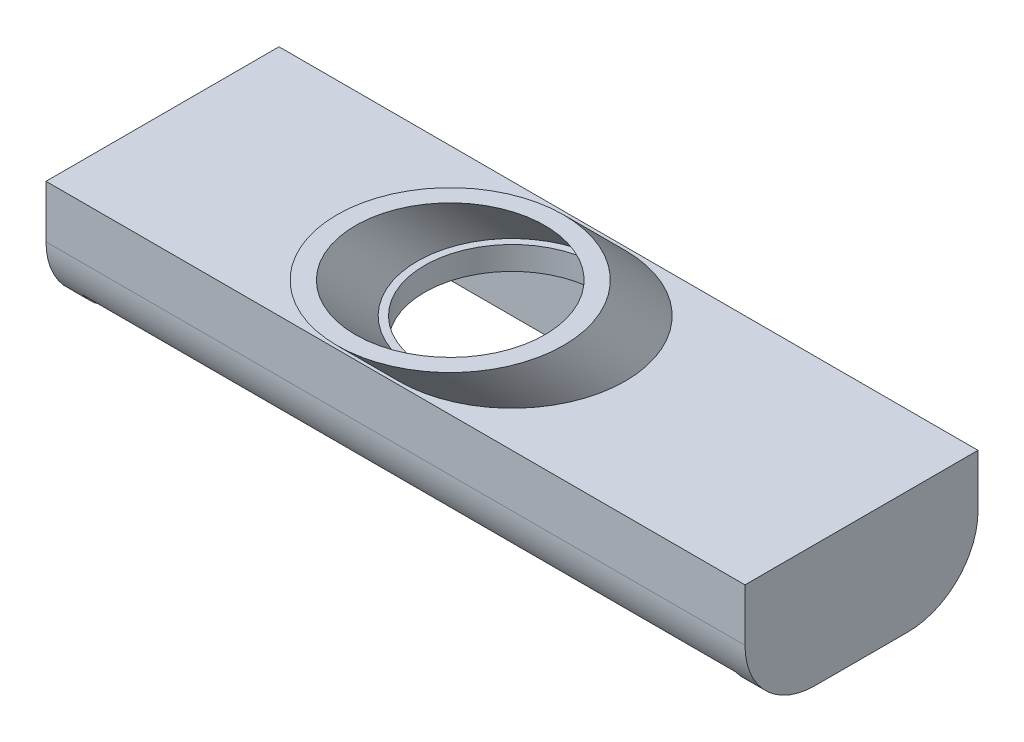
ISO-10303-21;
HEADER;
FILE_DESCRIPTION(('STEP AP214'),'2;1');
FILE_NAME('part.step','',(''),(''),'','','');
FILE_SCHEMA(('AUTOMOTIVE_DESIGN { 1 0 10303 214 1 1 1 1 }'));
ENDSEC;
DATA;
#1=APPLICATION_CONTEXT('core data for automotive mechanical design processes');
#2=APPLICATION_PROTOCOL_DEFINITION('international standard','automotive_design',2000,#1);
#3=PRODUCT_CONTEXT('',#1,'mechanical');
#4=PRODUCT('Part','Part','',(#3));
#5=PRODUCT_RELATED_PRODUCT_CATEGORY('part','',(#4));
#6=PRODUCT_DEFINITION_FORMATION('','',#4);
#7=PRODUCT_DEFINITION_CONTEXT('part definition',#1,'design');
#8=PRODUCT_DEFINITION('design','',#6,#7);
#9=PRODUCT_DEFINITION_SHAPE('','',#8);
#10=(LENGTH_UNIT() NAMED_UNIT(*) SI_UNIT(.MILLI.,.METRE.));
#11=(NAMED_UNIT(*) PLANE_ANGLE_UNIT() SI_UNIT($,.RADIAN.));
#12=(NAMED_UNIT(*) SI_UNIT($,.STERADIAN.) SOLID_ANGLE_UNIT());
#13=UNCERTAINTY_MEASURE_WITH_UNIT(LENGTH_MEASURE(1.E-05),#10,'distance_accuracy_value','');
#14=(GEOMETRIC_REPRESENTATION_CONTEXT(3) GLOBAL_UNCERTAINTY_ASSIGNED_CONTEXT((#13)) GLOBAL_UNIT_ASSIGNED_CONTEXT((#10,
#11,#12)) REPRESENTATION_CONTEXT('',''));
#15=CARTESIAN_POINT('',(0.,0.,0.));
#16=DIRECTION('',(0.,0.,1.));
#17=DIRECTION('',(1.,0.,0.));
#18=AXIS2_PLACEMENT_3D('',#15,#16,#17);
#19=CARTESIAN_POINT('',(0.,-12.,0.));
#20=DIRECTION('',(0.,-1.,0.));
#21=DIRECTION('',(0.,0.,-1.));
#22=AXIS2_PLACEMENT_3D('',#19,#20,#21);
#23=PLANE('',#22);
#24=DIRECTION('',(0.,0.,-1.));
#25=VECTOR('',#24,1.);
#26=CARTESIAN_POINT('',(8.76107220651789,-12.,38.936170212766));
#27=LINE('',#26,#25);
#28=CARTESIAN_POINT('',(8.76107220651789,-12.,36.6829645575749));
#29=VERTEX_POINT('',#28);
#30=CARTESIAN_POINT('',(8.76107220651789,-12.,1.18937586795699));
#31=VERTEX_POINT('',#30);
#32=EDGE_CURVE('E245',#29,#31,#27,.T.);
#33=ORIENTED_EDGE('',*,*,#32,.F.);
#34=DIRECTION('',(-1.,0.,0.));
#35=VECTOR('',#34,1.);
#36=CARTESIAN_POINT('',(8.76107220651789,-12.,36.6829645575749));
#37=LINE('',#36,#35);
#38=CARTESIAN_POINT('',(-103.322695035461,-12.,36.6829645575749));
#39=VERTEX_POINT('',#38);
#40=EDGE_CURVE('E215',#29,#39,#37,.T.);
#41=ORIENTED_EDGE('',*,*,#40,.T.);
#42=DIRECTION('',(0.,0.,1.));
#43=VECTOR('',#42,1.);
#44=CARTESIAN_POINT('',(-103.322695035461,-12.,38.936170212766));
#45=LINE('',#44,#43);
#46=CARTESIAN_POINT('',(-103.322695035461,-12.,34.936170212766));
#47=VERTEX_POINT('',#46);
#48=EDGE_CURVE('E191',#47,#39,#45,.T.);
#49=ORIENTED_EDGE('',*,*,#48,.F.);
#50=DIRECTION('',(1.,0.,0.));
#51=VECTOR('',#50,1.);
#52=CARTESIAN_POINT('',(0.,-12.,34.9361702127659));
#53=LINE('',#52,#51);
#54=CARTESIAN_POINT('',(8.67730496453901,-12.,34.9361702127659));
#55=VERTEX_POINT('',#54);
#56=EDGE_CURVE('E150',#47,#55,#53,.T.);
#57=ORIENTED_EDGE('',*,*,#56,.T.);
#58=DIRECTION('',(0.,0.,-1.));
#59=VECTOR('',#58,1.);
#60=CARTESIAN_POINT('',(8.67730496453902,-12.,0.));
#61=LINE('',#60,#59);
#62=CARTESIAN_POINT('',(8.67730496453902,-12.,2.93617021276596));
#63=VERTEX_POINT('',#62);
#64=EDGE_CURVE('E151',#55,#63,#61,.T.);
#65=ORIENTED_EDGE('',*,*,#64,.T.);
#66=DIRECTION('',(-1.,0.,0.));
#67=VECTOR('',#66,1.);
#68=CARTESIAN_POINT('',(0.,-12.,2.93617021276596));
#69=LINE('',#68,#67);
#70=CARTESIAN_POINT('',(-103.322695035461,-12.,2.93617021276594));
#71=VERTEX_POINT('',#70);
#72=EDGE_CURVE('E139',#63,#71,#69,.T.);
#73=ORIENTED_EDGE('',*,*,#72,.T.);
#74=CARTESIAN_POINT('',(-103.322695035461,-12.,1.189375867957));
#75=VERTEX_POINT('',#74);
#76=EDGE_CURVE('E206',#75,#71,#45,.T.);
#77=ORIENTED_EDGE('',*,*,#76,.F.);
#78=DIRECTION('',(1.,0.,0.));
#79=VECTOR('',#78,1.);
#80=CARTESIAN_POINT('',(-103.322695035461,-12.,1.189375867957));
#81=LINE('',#80,#79);
#82=EDGE_CURVE('E213',#75,#31,#81,.T.);
#83=ORIENTED_EDGE('',*,*,#82,.T.);
#84=EDGE_LOOP('',(#33,#41,#49,#57,#65,#73,#77,#83));
#85=FACE_BOUND('',#84,.T.);
#86=ADVANCED_FACE('F35',(#85),#23,.T.);
#87=CARTESIAN_POINT('',(0.,4.,0.));
#88=DIRECTION('',(0.,1.,0.));
#89=DIRECTION('',(0.,0.,1.));
#90=AXIS2_PLACEMENT_3D('',#87,#88,#89);
#91=PLANE('',#90);
#92=DIRECTION('',(0.,0.,1.));
#93=VECTOR('',#92,1.);
#94=CARTESIAN_POINT('',(-107.322695035461,4.,-1.06382978723404));
#95=LINE('',#94,#93);
#96=CARTESIAN_POINT('',(-107.322695035461,4.,-1.06382978723404));
#97=VERTEX_POINT('',#96);
#98=CARTESIAN_POINT('',(-107.322695035461,4.,38.936170212766));
#99=VERTEX_POINT('',#98);
#100=EDGE_CURVE('E163',#97,#99,#95,.T.);
#101=ORIENTED_EDGE('',*,*,#100,.T.);
#102=DIRECTION('',(1.,0.,0.));
#103=VECTOR('',#102,1.);
#104=CARTESIAN_POINT('',(-107.322695035461,4.,38.936170212766));
#105=LINE('',#104,#103);
#106=CARTESIAN_POINT('',(12.677304964539,4.,38.936170212766));
#107=VERTEX_POINT('',#106);
#108=EDGE_CURVE('E166',#99,#107,#105,.T.);
#109=ORIENTED_EDGE('',*,*,#108,.T.);
#110=DIRECTION('',(0.,0.,-1.));
#111=VECTOR('',#110,1.);
#112=CARTESIAN_POINT('',(12.677304964539,4.,-1.06382978723404));
#113=LINE('',#112,#111);
#114=CARTESIAN_POINT('',(12.677304964539,4.,-1.06382978723404));
#115=VERTEX_POINT('',#114);
#116=EDGE_CURVE('E175',#107,#115,#113,.T.);
#117=ORIENTED_EDGE('',*,*,#116,.T.);
#118=DIRECTION('',(-1.,0.,0.));
#119=VECTOR('',#118,1.);
#120=CARTESIAN_POINT('',(-107.322695035461,4.,-1.06382978723404));
#121=LINE('',#120,#119);
#122=EDGE_CURVE('E177',#115,#97,#121,.T.);
#123=ORIENTED_EDGE('',*,*,#122,.T.);
#124=EDGE_LOOP('',(#101,#109,#117,#123));
#125=FACE_BOUND('',#124,.T.);
#126=CARTESIAN_POINT('',(-47.322695035461,4.,18.936170212766));
#127=DIRECTION('',(0.,1.,0.));
#128=DIRECTION('',(0.,0.,1.));
#129=AXIS2_PLACEMENT_3D('',#126,#127,#128);
#130=CIRCLE('',#129,19.4409983521772);
#131=CARTESIAN_POINT('',(-47.322695035461,4.,38.3771685649432));
#132=VERTEX_POINT('',#131);
#133=EDGE_CURVE('E276',#132,#132,#130,.T.);
#134=ORIENTED_EDGE('',*,*,#133,.F.);
#135=EDGE_LOOP('',(#134));
#136=FACE_BOUND('',#135,.T.);
#137=ADVANCED_FACE('F295',(#125,#136),#91,.T.);
#138=CARTESIAN_POINT('',(-107.322695035461,4.,-1.06382978723404));
#139=DIRECTION('',(1.,0.,0.));
#140=DIRECTION('',(0.,0.,-1.));
#141=AXIS2_PLACEMENT_3D('',#138,#139,#140);
#142=PLANE('',#141);
#143=DIRECTION('',(0.,0.,-1.));
#144=VECTOR('',#143,1.);
#145=CARTESIAN_POINT('',(-107.322695035461,-17.,38.936170212766));
#146=LINE('',#145,#144);
#147=CARTESIAN_POINT('',(-107.322695035461,-17.,26.936170212766));
#148=VERTEX_POINT('',#147);
#149=CARTESIAN_POINT('',(-107.322695035461,-17.,10.936170212766));
#150=VERTEX_POINT('',#149);
#151=EDGE_CURVE('E209',#148,#150,#146,.T.);
#152=ORIENTED_EDGE('',*,*,#151,.F.);
#153=CARTESIAN_POINT('',(-107.322695035461,-5.,26.936170212766));
#154=DIRECTION('',(1.,0.,0.));
#155=DIRECTION('',(0.,0.,-1.));
#156=AXIS2_PLACEMENT_3D('',#153,#154,#155);
#157=CIRCLE('',#156,12.);
#158=CARTESIAN_POINT('',(-107.322695035461,-5.,38.936170212766));
#159=VERTEX_POINT('',#158);
#160=EDGE_CURVE('E227',#148,#159,#157,.F.);
#161=ORIENTED_EDGE('',*,*,#160,.T.);
#162=DIRECTION('',(0.,-1.,0.));
#163=VECTOR('',#162,1.);
#164=CARTESIAN_POINT('',(-107.322695035461,4.,38.936170212766));
#165=LINE('',#164,#163);
#166=EDGE_CURVE('E186',#99,#159,#165,.T.);
#167=ORIENTED_EDGE('',*,*,#166,.F.);
#168=ORIENTED_EDGE('',*,*,#100,.F.);
#169=DIRECTION('',(0.,-1.,0.));
#170=VECTOR('',#169,1.);
#171=CARTESIAN_POINT('',(-107.322695035461,4.,-1.06382978723404));
#172=LINE('',#171,#170);
#173=CARTESIAN_POINT('',(-107.322695035461,-5.,-1.06382978723404));
#174=VERTEX_POINT('',#173);
#175=EDGE_CURVE('E179',#97,#174,#172,.T.);
#176=ORIENTED_EDGE('',*,*,#175,.T.);
#177=CARTESIAN_POINT('',(-107.322695035461,-5.,10.936170212766));
#178=DIRECTION('',(1.,0.,0.));
#179=DIRECTION('',(0.,0.,-1.));
#180=AXIS2_PLACEMENT_3D('',#177,#178,#179);
#181=CIRCLE('',#180,12.);
#182=EDGE_CURVE('E225',#174,#150,#181,.F.);
#183=ORIENTED_EDGE('',*,*,#182,.T.);
#184=EDGE_LOOP('',(#152,#161,#167,#168,#176,#183));
#185=FACE_BOUND('',#184,.T.);
#186=ADVANCED_FACE('F322',(#185),#142,.F.);
#187=CARTESIAN_POINT('',(-107.322695035461,4.,38.936170212766));
#188=DIRECTION('',(0.,0.,-1.));
#189=DIRECTION('',(-1.,0.,0.));
#190=AXIS2_PLACEMENT_3D('',#187,#188,#189);
#191=PLANE('',#190);
#192=ORIENTED_EDGE('',*,*,#166,.T.);
#193=DIRECTION('',(-1.,0.,0.));
#194=VECTOR('',#193,1.);
#195=CARTESIAN_POINT('',(-107.322695035461,-5.,38.936170212766));
#196=LINE('',#195,#194);
#197=CARTESIAN_POINT('',(12.677304964539,-5.,38.936170212766));
#198=VERTEX_POINT('',#197);
#199=EDGE_CURVE('E58',#159,#198,#196,.F.);
#200=ORIENTED_EDGE('',*,*,#199,.T.);
#201=DIRECTION('',(0.,-1.,0.));
#202=VECTOR('',#201,1.);
#203=CARTESIAN_POINT('',(12.677304964539,4.,38.936170212766));
#204=LINE('',#203,#202);
#205=EDGE_CURVE('E184',#107,#198,#204,.T.);
#206=ORIENTED_EDGE('',*,*,#205,.F.);
#207=ORIENTED_EDGE('',*,*,#108,.F.);
#208=EDGE_LOOP('',(#192,#200,#206,#207));
#209=FACE_BOUND('',#208,.T.);
#210=ADVANCED_FACE('F319',(#209),#191,.F.);
#211=CARTESIAN_POINT('',(12.677304964539,4.,-1.06382978723404));
#212=DIRECTION('',(-1.,0.,0.));
#213=DIRECTION('',(0.,0.,1.));
#214=AXIS2_PLACEMENT_3D('',#211,#212,#213);
#215=PLANE('',#214);
#216=ORIENTED_EDGE('',*,*,#205,.T.);
#217=CARTESIAN_POINT('',(12.677304964539,-5.,26.936170212766));
#218=DIRECTION('',(-1.,0.,0.));
#219=DIRECTION('',(0.,0.,1.));
#220=AXIS2_PLACEMENT_3D('',#217,#218,#219);
#221=CIRCLE('',#220,12.);
#222=CARTESIAN_POINT('',(12.677304964539,-17.,26.936170212766));
#223=VERTEX_POINT('',#222);
#224=EDGE_CURVE('E43',#198,#223,#221,.F.);
#225=ORIENTED_EDGE('',*,*,#224,.T.);
#226=DIRECTION('',(0.,0.,1.));
#227=VECTOR('',#226,1.);
#228=CARTESIAN_POINT('',(12.677304964539,-17.,38.936170212766));
#229=LINE('',#228,#227);
#230=CARTESIAN_POINT('',(12.677304964539,-17.,10.936170212766));
#231=VERTEX_POINT('',#230);
#232=EDGE_CURVE('E233',#231,#223,#229,.T.);
#233=ORIENTED_EDGE('',*,*,#232,.F.);
#234=CARTESIAN_POINT('',(12.677304964539,-5.,10.936170212766));
#235=DIRECTION('',(-1.,0.,0.));
#236=DIRECTION('',(0.,0.,1.));
#237=AXIS2_PLACEMENT_3D('',#234,#235,#236);
#238=CIRCLE('',#237,12.);
#239=CARTESIAN_POINT('',(12.677304964539,-5.,-1.06382978723404));
#240=VERTEX_POINT('',#239);
#241=EDGE_CURVE('E50',#231,#240,#238,.F.);
#242=ORIENTED_EDGE('',*,*,#241,.T.);
#243=DIRECTION('',(0.,-1.,0.));
#244=VECTOR('',#243,1.);
#245=CARTESIAN_POINT('',(12.677304964539,4.,-1.06382978723404));
#246=LINE('',#245,#244);
#247=EDGE_CURVE('E182',#115,#240,#246,.T.);
#248=ORIENTED_EDGE('',*,*,#247,.F.);
#249=ORIENTED_EDGE('',*,*,#116,.F.);
#250=EDGE_LOOP('',(#216,#225,#233,#242,#248,#249));
#251=FACE_BOUND('',#250,.T.);
#252=ADVANCED_FACE('F232',(#251),#215,.F.);
#253=CARTESIAN_POINT('',(-107.322695035461,4.,-1.06382978723404));
#254=DIRECTION('',(0.,0.,1.));
#255=DIRECTION('',(1.,0.,0.));
#256=AXIS2_PLACEMENT_3D('',#253,#254,#255);
#257=PLANE('',#256);
#258=ORIENTED_EDGE('',*,*,#247,.T.);
#259=DIRECTION('',(1.,0.,0.));
#260=VECTOR('',#259,1.);
#261=CARTESIAN_POINT('',(-107.322695035461,-5.,-1.06382978723404));
#262=LINE('',#261,#260);
#263=EDGE_CURVE('E11',#240,#174,#262,.F.);
#264=ORIENTED_EDGE('',*,*,#263,.T.);
#265=ORIENTED_EDGE('',*,*,#175,.F.);
#266=ORIENTED_EDGE('',*,*,#122,.F.);
#267=EDGE_LOOP('',(#258,#264,#265,#266));
#268=FACE_BOUND('',#267,.T.);
#269=ADVANCED_FACE('F305',(#268),#257,.F.);
#270=CARTESIAN_POINT('',(8.67730496453902,-12.,0.));
#271=DIRECTION('',(1.,0.,0.));
#272=DIRECTION('',(0.,0.,-1.));
#273=AXIS2_PLACEMENT_3D('',#270,#271,#272);
#274=PLANE('',#273);
#275=DIRECTION('',(0.,0.,-1.));
#276=VECTOR('',#275,1.);
#277=CARTESIAN_POINT('',(8.67730496453902,0.,0.));
#278=LINE('',#277,#276);
#279=CARTESIAN_POINT('',(8.67730496453901,0.,34.9361702127659));
#280=VERTEX_POINT('',#279);
#281=CARTESIAN_POINT('',(8.67730496453902,0.,2.93617021276596));
#282=VERTEX_POINT('',#281);
#283=EDGE_CURVE('E162',#280,#282,#278,.T.);
#284=ORIENTED_EDGE('',*,*,#283,.T.);
#285=DIRECTION('',(0.,1.,0.));
#286=VECTOR('',#285,1.);
#287=CARTESIAN_POINT('',(8.67730496453902,-12.,2.93617021276596));
#288=LINE('',#287,#286);
#289=EDGE_CURVE('E144',#63,#282,#288,.T.);
#290=ORIENTED_EDGE('',*,*,#289,.F.);
#291=ORIENTED_EDGE('',*,*,#64,.F.);
#292=DIRECTION('',(0.,1.,0.));
#293=VECTOR('',#292,1.);
#294=CARTESIAN_POINT('',(8.67730496453901,-12.,34.9361702127659));
#295=LINE('',#294,#293);
#296=EDGE_CURVE('E171',#55,#280,#295,.T.);
#297=ORIENTED_EDGE('',*,*,#296,.T.);
#298=EDGE_LOOP('',(#284,#290,#291,#297));
#299=FACE_BOUND('',#298,.T.);
#300=ADVANCED_FACE('F161',(#299),#274,.F.);
#301=CARTESIAN_POINT('',(0.,-12.,2.93617021276596));
#302=DIRECTION('',(0.,0.,-1.));
#303=DIRECTION('',(-1.,0.,0.));
#304=AXIS2_PLACEMENT_3D('',#301,#302,#303);
#305=PLANE('',#304);
#306=DIRECTION('',(-1.,0.,0.));
#307=VECTOR('',#306,1.);
#308=CARTESIAN_POINT('',(0.,0.,2.93617021276596));
#309=LINE('',#308,#307);
#310=CARTESIAN_POINT('',(-103.322695035461,0.,2.93617021276594));
#311=VERTEX_POINT('',#310);
#312=EDGE_CURVE('E270',#282,#311,#309,.T.);
#313=ORIENTED_EDGE('',*,*,#312,.T.);
#314=DIRECTION('',(0.,1.,0.));
#315=VECTOR('',#314,1.);
#316=CARTESIAN_POINT('',(-103.322695035461,-12.,2.93617021276594));
#317=LINE('',#316,#315);
#318=EDGE_CURVE('E147',#71,#311,#317,.T.);
#319=ORIENTED_EDGE('',*,*,#318,.F.);
#320=ORIENTED_EDGE('',*,*,#72,.F.);
#321=ORIENTED_EDGE('',*,*,#289,.T.);
#322=EDGE_LOOP('',(#313,#319,#320,#321));
#323=FACE_BOUND('',#322,.T.);
#324=ADVANCED_FACE('F142',(#323),#305,.F.);
#325=CARTESIAN_POINT('',(-103.322695035461,-12.,0.));
#326=DIRECTION('',(1.,0.,0.));
#327=DIRECTION('',(0.,0.,-1.));
#328=AXIS2_PLACEMENT_3D('',#325,#326,#327);
#329=PLANE('',#328);
#330=ORIENTED_EDGE('',*,*,#48,.T.);
#331=CARTESIAN_POINT('',(-103.322695035461,-5.,26.936170212766));
#332=DIRECTION('',(1.,0.,0.));
#333=DIRECTION('',(0.,0.,-1.));
#334=AXIS2_PLACEMENT_3D('',#331,#332,#333);
#335=CIRCLE('',#334,12.);
#336=CARTESIAN_POINT('',(-103.322695035461,-17.,26.936170212766));
#337=VERTEX_POINT('',#336);
#338=EDGE_CURVE('E219',#39,#337,#335,.T.);
#339=ORIENTED_EDGE('',*,*,#338,.T.);
#340=DIRECTION('',(0.,0.,1.));
#341=VECTOR('',#340,1.);
#342=CARTESIAN_POINT('',(-103.322695035461,-17.,38.936170212766));
#343=LINE('',#342,#341);
#344=CARTESIAN_POINT('',(-103.322695035461,-17.,10.936170212766));
#345=VERTEX_POINT('',#344);
#346=EDGE_CURVE('E200',#345,#337,#343,.T.);
#347=ORIENTED_EDGE('',*,*,#346,.F.);
#348=CARTESIAN_POINT('',(-103.322695035461,-5.,10.936170212766));
#349=DIRECTION('',(1.,0.,0.));
#350=DIRECTION('',(0.,0.,-1.));
#351=AXIS2_PLACEMENT_3D('',#348,#349,#350);
#352=CIRCLE('',#351,12.);
#353=EDGE_CURVE('E217',#345,#75,#352,.T.);
#354=ORIENTED_EDGE('',*,*,#353,.T.);
#355=ORIENTED_EDGE('',*,*,#76,.T.);
#356=ORIENTED_EDGE('',*,*,#318,.T.);
#357=DIRECTION('',(0.,0.,-1.));
#358=VECTOR('',#357,1.);
#359=CARTESIAN_POINT('',(-103.322695035461,0.,0.));
#360=LINE('',#359,#358);
#361=CARTESIAN_POINT('',(-103.322695035461,0.,34.936170212766));
#362=VERTEX_POINT('',#361);
#363=EDGE_CURVE('E267',#362,#311,#360,.T.);
#364=ORIENTED_EDGE('',*,*,#363,.F.);
#365=DIRECTION('',(0.,1.,0.));
#366=VECTOR('',#365,1.);
#367=CARTESIAN_POINT('',(-103.322695035461,-12.,34.936170212766));
#368=LINE('',#367,#366);
#369=EDGE_CURVE('E168',#47,#362,#368,.T.);
#370=ORIENTED_EDGE('',*,*,#369,.F.);
#371=EDGE_LOOP('',(#330,#339,#347,#354,#355,#356,#364,#370));
#372=FACE_BOUND('',#371,.T.);
#373=ADVANCED_FACE('F268',(#372),#329,.T.);
#374=CARTESIAN_POINT('',(0.,-12.,34.9361702127659));
#375=DIRECTION('',(0.,0.,1.));
#376=DIRECTION('',(1.,0.,0.));
#377=AXIS2_PLACEMENT_3D('',#374,#375,#376);
#378=PLANE('',#377);
#379=DIRECTION('',(1.,0.,0.));
#380=VECTOR('',#379,1.);
#381=CARTESIAN_POINT('',(0.,0.,34.9361702127659));
#382=LINE('',#381,#380);
#383=EDGE_CURVE('E159',#362,#280,#382,.T.);
#384=ORIENTED_EDGE('',*,*,#383,.T.);
#385=ORIENTED_EDGE('',*,*,#296,.F.);
#386=ORIENTED_EDGE('',*,*,#56,.F.);
#387=ORIENTED_EDGE('',*,*,#369,.T.);
#388=EDGE_LOOP('',(#384,#385,#386,#387));
#389=FACE_BOUND('',#388,.T.);
#390=ADVANCED_FACE('F265',(#389),#378,.F.);
#391=CARTESIAN_POINT('',(0.,0.,0.));
#392=DIRECTION('',(0.,1.,0.));
#393=DIRECTION('',(0.,0.,1.));
#394=AXIS2_PLACEMENT_3D('',#391,#392,#393);
#395=PLANE('',#394);
#396=CARTESIAN_POINT('',(-47.322695035461,0.,18.936170212766));
#397=DIRECTION('',(0.,-1.,0.));
#398=DIRECTION('',(0.,0.,-1.));
#399=AXIS2_PLACEMENT_3D('',#396,#397,#398);
#400=CIRCLE('',#399,15.);
#401=CARTESIAN_POINT('',(-47.322695035461,0.,3.93617021276596));
#402=VERTEX_POINT('',#401);
#403=EDGE_CURVE('E356',#402,#402,#400,.T.);
#404=ORIENTED_EDGE('',*,*,#403,.F.);
#405=EDGE_LOOP('',(#404));
#406=FACE_BOUND('',#405,.T.);
#407=ORIENTED_EDGE('',*,*,#283,.F.);
#408=ORIENTED_EDGE('',*,*,#383,.F.);
#409=ORIENTED_EDGE('',*,*,#363,.T.);
#410=ORIENTED_EDGE('',*,*,#312,.F.);
#411=EDGE_LOOP('',(#407,#408,#409,#410));
#412=FACE_BOUND('',#411,.T.);
#413=ADVANCED_FACE('F298',(#406,#412),#395,.F.);
#414=CARTESIAN_POINT('',(-47.322695035461,14.6066017177982,29.5427719305642));
#415=DIRECTION('',(0.,1.,0.));
#416=DIRECTION('',(0.,0.,1.));
#417=AXIS2_PLACEMENT_3D('',#414,#415,#416);
#418=PLANE('',#417);
#419=CARTESIAN_POINT('',(-47.322695035461,14.6066017177982,29.5427719305642));
#420=DIRECTION('',(0.,1.,0.));
#421=DIRECTION('',(0.,0.,1.));
#422=AXIS2_PLACEMENT_3D('',#419,#420,#421);
#423=CIRCLE('',#422,19.4409983521772);
#424=CARTESIAN_POINT('',(-47.322695035461,14.6066017177982,48.9837702827414));
#425=VERTEX_POINT('',#424);
#426=EDGE_CURVE('E274',#425,#425,#423,.T.);
#427=ORIENTED_EDGE('',*,*,#426,.T.);
#428=EDGE_LOOP('',(#427));
#429=FACE_BOUND('',#428,.T.);
#430=CARTESIAN_POINT('',(-47.322695035461,14.6066017177982,29.5427719305642));
#431=DIRECTION('',(0.,1.,0.));
#432=DIRECTION('',(0.,0.,1.));
#433=AXIS2_PLACEMENT_3D('',#430,#431,#432);
#434=CIRCLE('',#433,16.25);
#435=CARTESIAN_POINT('',(-47.322695035461,14.6066017177982,45.7927719305642));
#436=VERTEX_POINT('',#435);
#437=EDGE_CURVE('E279',#436,#436,#434,.T.);
#438=ORIENTED_EDGE('',*,*,#437,.F.);
#439=EDGE_LOOP('',(#438));
#440=FACE_BOUND('',#439,.T.);
#441=ADVANCED_FACE('F290',(#429,#440),#418,.T.);
#442=DIRECTION('',(0.,-0.707106781186544,-0.707106781186551));
#443=VECTOR('',#442,1.);
#444=SURFACE_OF_LINEAR_EXTRUSION('',#423,#443);
#445=ORIENTED_EDGE('',*,*,#426,.F.);
#446=EDGE_LOOP('',(#445));
#447=FACE_BOUND('',#446,.T.);
#448=ORIENTED_EDGE('',*,*,#133,.T.);
#449=EDGE_LOOP('',(#448));
#450=FACE_BOUND('',#449,.T.);
#451=ADVANCED_FACE('F285',(#447,#450),#444,.F.);
#452=DIRECTION('',(0.,-0.707106781186544,-0.707106781186551));
#453=VECTOR('',#452,1.);
#454=SURFACE_OF_LINEAR_EXTRUSION('',#434,#453);
#455=ORIENTED_EDGE('',*,*,#437,.T.);
#456=EDGE_LOOP('',(#455));
#457=FACE_BOUND('',#456,.T.);
#458=CARTESIAN_POINT('',(-47.322695035461,4.,18.936170212766));
#459=DIRECTION('',(0.,1.,0.));
#460=DIRECTION('',(0.,0.,1.));
#461=AXIS2_PLACEMENT_3D('',#458,#459,#460);
#462=CIRCLE('',#461,16.25);
#463=CARTESIAN_POINT('',(-47.322695035461,4.,35.186170212766));
#464=VERTEX_POINT('',#463);
#465=EDGE_CURVE('E188',#464,#464,#462,.F.);
#466=ORIENTED_EDGE('',*,*,#465,.T.);
#467=EDGE_LOOP('',(#466));
#468=FACE_BOUND('',#467,.T.);
#469=ADVANCED_FACE('F289',(#457,#468),#454,.T.);
#470=CARTESIAN_POINT('',(-47.322695035461,4.,18.936170212766));
#471=DIRECTION('',(0.,-1.,0.));
#472=DIRECTION('',(0.,0.,-1.));
#473=AXIS2_PLACEMENT_3D('',#470,#471,#472);
#474=CIRCLE('',#473,15.);
#475=CARTESIAN_POINT('',(-47.322695035461,4.,3.93617021276596));
#476=VERTEX_POINT('',#475);
#477=EDGE_CURVE('E202',#476,#476,#474,.T.);
#478=ORIENTED_EDGE('',*,*,#477,.T.);
#479=EDGE_LOOP('',(#478));
#480=FACE_BOUND('',#479,.T.);
#481=ORIENTED_EDGE('',*,*,#465,.F.);
#482=EDGE_LOOP('',(#481));
#483=FACE_BOUND('',#482,.T.);
#484=ADVANCED_FACE('F306',(#480,#483),#91,.T.);
#485=CARTESIAN_POINT('',(-47.322695035461,4.,18.936170212766));
#486=DIRECTION('',(0.,-1.,0.));
#487=DIRECTION('',(0.,0.,-1.));
#488=AXIS2_PLACEMENT_3D('',#485,#486,#487);
#489=CYLINDRICAL_SURFACE('',#488,15.);
#490=ORIENTED_EDGE('',*,*,#477,.F.);
#491=EDGE_LOOP('',(#490));
#492=FACE_BOUND('',#491,.T.);
#493=ORIENTED_EDGE('',*,*,#403,.T.);
#494=EDGE_LOOP('',(#493));
#495=FACE_BOUND('',#494,.T.);
#496=ADVANCED_FACE('F309',(#492,#495),#489,.F.);
#497=CARTESIAN_POINT('',(0.,-17.,0.));
#498=DIRECTION('',(0.,-1.,0.));
#499=DIRECTION('',(0.,0.,-1.));
#500=AXIS2_PLACEMENT_3D('',#497,#498,#499);
#501=PLANE('',#500);
#502=ORIENTED_EDGE('',*,*,#346,.T.);
#503=DIRECTION('',(-1.,0.,0.));
#504=VECTOR('',#503,1.);
#505=CARTESIAN_POINT('',(-105.322695035461,-17.,26.936170212766));
#506=LINE('',#505,#504);
#507=EDGE_CURVE('E223',#337,#148,#506,.T.);
#508=ORIENTED_EDGE('',*,*,#507,.T.);
#509=ORIENTED_EDGE('',*,*,#151,.T.);
#510=DIRECTION('',(1.,0.,0.));
#511=VECTOR('',#510,1.);
#512=CARTESIAN_POINT('',(-105.322695035461,-17.,10.936170212766));
#513=LINE('',#512,#511);
#514=EDGE_CURVE('E221',#150,#345,#513,.T.);
#515=ORIENTED_EDGE('',*,*,#514,.T.);
#516=EDGE_LOOP('',(#502,#508,#509,#515));
#517=FACE_BOUND('',#516,.T.);
#518=ADVANCED_FACE('F336',(#517),#501,.T.);
#519=CARTESIAN_POINT('',(8.76107220651789,-17.,38.936170212766));
#520=DIRECTION('',(1.,0.,0.));
#521=DIRECTION('',(0.,0.,-1.));
#522=AXIS2_PLACEMENT_3D('',#519,#520,#521);
#523=PLANE('',#522);
#524=DIRECTION('',(0.,0.,-1.));
#525=VECTOR('',#524,1.);
#526=CARTESIAN_POINT('',(8.76107220651789,-17.,38.936170212766));
#527=LINE('',#526,#525);
#528=CARTESIAN_POINT('',(8.76107220651789,-17.,26.936170212766));
#529=VERTEX_POINT('',#528);
#530=CARTESIAN_POINT('',(8.76107220651789,-17.,10.936170212766));
#531=VERTEX_POINT('',#530);
#532=EDGE_CURVE('E210',#529,#531,#527,.T.);
#533=ORIENTED_EDGE('',*,*,#532,.F.);
#534=CARTESIAN_POINT('',(8.76107220651789,-5.,26.936170212766));
#535=DIRECTION('',(1.,0.,0.));
#536=DIRECTION('',(0.,0.,-1.));
#537=AXIS2_PLACEMENT_3D('',#534,#535,#536);
#538=CIRCLE('',#537,12.);
#539=EDGE_CURVE('E211',#529,#29,#538,.F.);
#540=ORIENTED_EDGE('',*,*,#539,.T.);
#541=ORIENTED_EDGE('',*,*,#32,.T.);
#542=CARTESIAN_POINT('',(8.76107220651789,-5.,10.936170212766));
#543=DIRECTION('',(1.,0.,0.));
#544=DIRECTION('',(0.,0.,-1.));
#545=AXIS2_PLACEMENT_3D('',#542,#543,#544);
#546=CIRCLE('',#545,12.);
#547=EDGE_CURVE('E249',#31,#531,#546,.F.);
#548=ORIENTED_EDGE('',*,*,#547,.T.);
#549=EDGE_LOOP('',(#533,#540,#541,#548));
#550=FACE_BOUND('',#549,.T.);
#551=ADVANCED_FACE('F331',(#550),#523,.F.);
#552=CARTESIAN_POINT('',(0.,-17.,0.));
#553=DIRECTION('',(0.,1.,0.));
#554=DIRECTION('',(0.,0.,1.));
#555=AXIS2_PLACEMENT_3D('',#552,#553,#554);
#556=PLANE('',#555);
#557=ORIENTED_EDGE('',*,*,#232,.T.);
#558=DIRECTION('',(-1.,0.,0.));
#559=VECTOR('',#558,1.);
#560=CARTESIAN_POINT('',(0.,-17.,26.936170212766));
#561=LINE('',#560,#559);
#562=EDGE_CURVE('E242',#223,#529,#561,.T.);
#563=ORIENTED_EDGE('',*,*,#562,.T.);
#564=ORIENTED_EDGE('',*,*,#532,.T.);
#565=DIRECTION('',(1.,0.,0.));
#566=VECTOR('',#565,1.);
#567=CARTESIAN_POINT('',(0.,-17.,10.936170212766));
#568=LINE('',#567,#566);
#569=EDGE_CURVE('E195',#531,#231,#568,.T.);
#570=ORIENTED_EDGE('',*,*,#569,.T.);
#571=EDGE_LOOP('',(#557,#563,#564,#570));
#572=FACE_BOUND('',#571,.T.);
#573=ADVANCED_FACE('F240',(#572),#556,.F.);
#574=CARTESIAN_POINT('',(0.,-5.,26.936170212766));
#575=DIRECTION('',(-1.,0.,0.));
#576=DIRECTION('',(0.,0.,1.));
#577=AXIS2_PLACEMENT_3D('',#574,#575,#576);
#578=CYLINDRICAL_SURFACE('',#577,12.);
#579=ORIENTED_EDGE('',*,*,#224,.F.);
#580=ORIENTED_EDGE('',*,*,#199,.F.);
#581=ORIENTED_EDGE('',*,*,#160,.F.);
#582=ORIENTED_EDGE('',*,*,#507,.F.);
#583=ORIENTED_EDGE('',*,*,#338,.F.);
#584=ORIENTED_EDGE('',*,*,#40,.F.);
#585=ORIENTED_EDGE('',*,*,#539,.F.);
#586=ORIENTED_EDGE('',*,*,#562,.F.);
#587=EDGE_LOOP('',(#579,#580,#581,#582,#583,#584,#585,#586));
#588=FACE_BOUND('',#587,.T.);
#589=ADVANCED_FACE('F247',(#588),#578,.T.);
#590=CARTESIAN_POINT('',(0.,-5.,10.936170212766));
#591=DIRECTION('',(1.,0.,0.));
#592=DIRECTION('',(0.,0.,-1.));
#593=AXIS2_PLACEMENT_3D('',#590,#591,#592);
#594=CYLINDRICAL_SURFACE('',#593,12.);
#595=ORIENTED_EDGE('',*,*,#182,.F.);
#596=ORIENTED_EDGE('',*,*,#263,.F.);
#597=ORIENTED_EDGE('',*,*,#241,.F.);
#598=ORIENTED_EDGE('',*,*,#569,.F.);
#599=ORIENTED_EDGE('',*,*,#547,.F.);
#600=ORIENTED_EDGE('',*,*,#82,.F.);
#601=ORIENTED_EDGE('',*,*,#353,.F.);
#602=ORIENTED_EDGE('',*,*,#514,.F.);
#603=EDGE_LOOP('',(#595,#596,#597,#598,#599,#600,#601,#602));
#604=FACE_BOUND('',#603,.T.);
#605=ADVANCED_FACE('F37',(#604),#594,.T.);
#606=CLOSED_SHELL('',(#86,#137,#186,#210,#252,#269,#300,#324,#373,#390,#413,#441,#451,#469,#484,
#496,#518,#551,#573,#589,#605));
#607=MANIFOLD_SOLID_BREP('B2',#606);
#608=ADVANCED_BREP_SHAPE_REPRESENTATION('',(#18,#607),#14);
#609=SHAPE_DEFINITION_REPRESENTATION(#9,#608);
ENDSEC;
END-ISO-10303-21;
